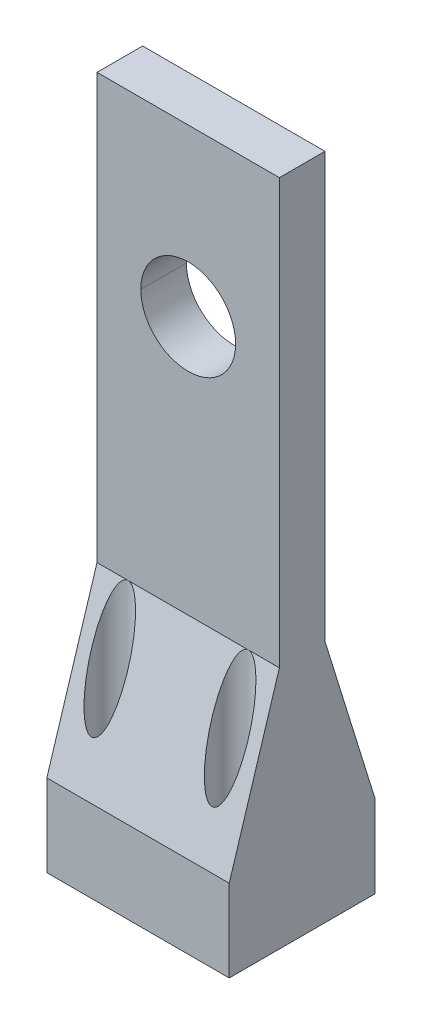
ISO-10303-21;
HEADER;
FILE_DESCRIPTION(('STEP AP214'),'2;1');
FILE_NAME('part.step','',(''),(''),'','','');
FILE_SCHEMA(('AUTOMOTIVE_DESIGN { 1 0 10303 214 1 1 1 1 }'));
ENDSEC;
DATA;
#1=APPLICATION_CONTEXT('core data for automotive mechanical design processes');
#2=APPLICATION_PROTOCOL_DEFINITION('international standard','automotive_design',2000,#1);
#3=PRODUCT_CONTEXT('',#1,'mechanical');
#4=PRODUCT('Part','Part','',(#3));
#5=PRODUCT_RELATED_PRODUCT_CATEGORY('part','',(#4));
#6=PRODUCT_DEFINITION_FORMATION('','',#4);
#7=PRODUCT_DEFINITION_CONTEXT('part definition',#1,'design');
#8=PRODUCT_DEFINITION('design','',#6,#7);
#9=PRODUCT_DEFINITION_SHAPE('','',#8);
#10=(LENGTH_UNIT() NAMED_UNIT(*) SI_UNIT(.MILLI.,.METRE.));
#11=(NAMED_UNIT(*) PLANE_ANGLE_UNIT() SI_UNIT($,.RADIAN.));
#12=(NAMED_UNIT(*) SI_UNIT($,.STERADIAN.) SOLID_ANGLE_UNIT());
#13=UNCERTAINTY_MEASURE_WITH_UNIT(LENGTH_MEASURE(1.E-05),#10,'distance_accuracy_value','');
#14=(GEOMETRIC_REPRESENTATION_CONTEXT(3) GLOBAL_UNCERTAINTY_ASSIGNED_CONTEXT((#13)) GLOBAL_UNIT_ASSIGNED_CONTEXT((#10,
#11,#12)) REPRESENTATION_CONTEXT('',''));
#15=CARTESIAN_POINT('',(0.,0.,0.));
#16=DIRECTION('',(0.,0.,1.));
#17=DIRECTION('',(1.,0.,0.));
#18=AXIS2_PLACEMENT_3D('',#15,#16,#17);
#19=CARTESIAN_POINT('',(6.8,5.,-4.));
#20=DIRECTION('',(0.,1.,0.));
#21=DIRECTION('',(0.,0.,-1.));
#22=AXIS2_PLACEMENT_3D('',#19,#20,#21);
#23=CYLINDRICAL_SURFACE('',#22,2.165);
#24=CARTESIAN_POINT('',(6.8,5.,-4.));
#25=DIRECTION('',(0.,-1.,0.));
#26=DIRECTION('',(1.,0.,0.));
#27=AXIS2_PLACEMENT_3D('',#24,#25,#26);
#28=CIRCLE('',#27,2.165);
#29=CARTESIAN_POINT('',(6.8,5.,-6.165));
#30=VERTEX_POINT('',#29);
#31=CARTESIAN_POINT('',(6.8,5.,-1.835));
#32=VERTEX_POINT('',#31);
#33=EDGE_CURVE('E343',#30,#32,#28,.T.);
#34=ORIENTED_EDGE('',*,*,#33,.F.);
#35=DIRECTION('',(0.,-1.,0.));
#36=VECTOR('',#35,1.);
#37=CARTESIAN_POINT('',(6.8,5.,-6.165));
#38=LINE('',#37,#36);
#39=CARTESIAN_POINT('',(6.8,-13.,-6.165));
#40=VERTEX_POINT('',#39);
#41=EDGE_CURVE('E347',#30,#40,#38,.T.);
#42=ORIENTED_EDGE('',*,*,#41,.T.);
#43=CARTESIAN_POINT('',(6.8,-13.,-4.));
#44=DIRECTION('',(0.,1.,0.));
#45=DIRECTION('',(0.,0.,1.));
#46=AXIS2_PLACEMENT_3D('',#43,#44,#45);
#47=CIRCLE('',#46,2.165);
#48=CARTESIAN_POINT('',(6.8,-13.,-1.835));
#49=VERTEX_POINT('',#48);
#50=EDGE_CURVE('E348',#49,#40,#47,.T.);
#51=ORIENTED_EDGE('',*,*,#50,.F.);
#52=DIRECTION('',(0.,1.,0.));
#53=VECTOR('',#52,1.);
#54=CARTESIAN_POINT('',(6.8,-13.,-1.835));
#55=LINE('',#54,#53);
#56=EDGE_CURVE('E352',#49,#32,#55,.T.);
#57=ORIENTED_EDGE('',*,*,#56,.T.);
#58=EDGE_LOOP('',(#34,#42,#51,#57));
#59=FACE_BOUND('',#58,.T.);
#60=ADVANCED_FACE('F39',(#59),#23,.F.);
#61=CARTESIAN_POINT('',(6.8,5.,-4.));
#62=DIRECTION('',(0.,1.,0.));
#63=DIRECTION('',(0.,0.,-1.));
#64=AXIS2_PLACEMENT_3D('',#61,#62,#63);
#65=CYLINDRICAL_SURFACE('',#64,2.165);
#66=CARTESIAN_POINT('',(6.8,5.,-4.));
#67=DIRECTION('',(0.,-1.,0.));
#68=DIRECTION('',(-1.,0.,0.));
#69=AXIS2_PLACEMENT_3D('',#66,#67,#68);
#70=CIRCLE('',#69,2.165);
#71=EDGE_CURVE('E356',#32,#30,#70,.T.);
#72=ORIENTED_EDGE('',*,*,#71,.F.);
#73=ORIENTED_EDGE('',*,*,#56,.F.);
#74=CARTESIAN_POINT('',(6.8,-13.,-4.));
#75=DIRECTION('',(0.,1.,0.));
#76=DIRECTION('',(0.,0.,-1.));
#77=AXIS2_PLACEMENT_3D('',#74,#75,#76);
#78=CIRCLE('',#77,2.165);
#79=EDGE_CURVE('E351',#40,#49,#78,.T.);
#80=ORIENTED_EDGE('',*,*,#79,.F.);
#81=ORIENTED_EDGE('',*,*,#41,.F.);
#82=EDGE_LOOP('',(#72,#73,#80,#81));
#83=FACE_BOUND('',#82,.T.);
#84=ADVANCED_FACE('F457',(#83),#65,.F.);
#85=CARTESIAN_POINT('',(33.2,5.,-4.));
#86=DIRECTION('',(0.,1.,0.));
#87=DIRECTION('',(0.,0.,-1.));
#88=AXIS2_PLACEMENT_3D('',#85,#86,#87);
#89=CYLINDRICAL_SURFACE('',#88,2.165);
#90=CARTESIAN_POINT('',(33.2,5.,-4.));
#91=DIRECTION('',(0.,-1.,0.));
#92=DIRECTION('',(-1.,0.,0.));
#93=AXIS2_PLACEMENT_3D('',#90,#91,#92);
#94=CIRCLE('',#93,2.165);
#95=CARTESIAN_POINT('',(33.2,5.,-1.835));
#96=VERTEX_POINT('',#95);
#97=CARTESIAN_POINT('',(33.2,5.,-6.165));
#98=VERTEX_POINT('',#97);
#99=EDGE_CURVE('E375',#96,#98,#94,.T.);
#100=ORIENTED_EDGE('',*,*,#99,.F.);
#101=DIRECTION('',(0.,1.,0.));
#102=VECTOR('',#101,1.);
#103=CARTESIAN_POINT('',(33.2,-13.,-1.835));
#104=LINE('',#103,#102);
#105=CARTESIAN_POINT('',(33.2,-13.,-1.835));
#106=VERTEX_POINT('',#105);
#107=EDGE_CURVE('E364',#106,#96,#104,.T.);
#108=ORIENTED_EDGE('',*,*,#107,.F.);
#109=CARTESIAN_POINT('',(33.2,-13.,-4.));
#110=DIRECTION('',(0.,1.,0.));
#111=DIRECTION('',(0.,0.,-1.));
#112=AXIS2_PLACEMENT_3D('',#109,#110,#111);
#113=CIRCLE('',#112,2.165);
#114=CARTESIAN_POINT('',(33.2,-13.,-6.165));
#115=VERTEX_POINT('',#114);
#116=EDGE_CURVE('E268',#115,#106,#113,.T.);
#117=ORIENTED_EDGE('',*,*,#116,.F.);
#118=DIRECTION('',(0.,-1.,0.));
#119=VECTOR('',#118,1.);
#120=CARTESIAN_POINT('',(33.2,5.,-6.165));
#121=LINE('',#120,#119);
#122=EDGE_CURVE('E263',#98,#115,#121,.T.);
#123=ORIENTED_EDGE('',*,*,#122,.F.);
#124=EDGE_LOOP('',(#100,#108,#117,#123));
#125=FACE_BOUND('',#124,.T.);
#126=ADVANCED_FACE('F444',(#125),#89,.F.);
#127=CARTESIAN_POINT('',(33.2,5.,-4.));
#128=DIRECTION('',(0.,1.,0.));
#129=DIRECTION('',(0.,0.,-1.));
#130=AXIS2_PLACEMENT_3D('',#127,#128,#129);
#131=CYLINDRICAL_SURFACE('',#130,2.165);
#132=CARTESIAN_POINT('',(33.2,5.,-4.));
#133=DIRECTION('',(0.,-1.,0.));
#134=DIRECTION('',(1.,0.,0.));
#135=AXIS2_PLACEMENT_3D('',#132,#133,#134);
#136=CIRCLE('',#135,2.165);
#137=EDGE_CURVE('E315',#98,#96,#136,.T.);
#138=ORIENTED_EDGE('',*,*,#137,.F.);
#139=ORIENTED_EDGE('',*,*,#122,.T.);
#140=CARTESIAN_POINT('',(33.2,-13.,-4.));
#141=DIRECTION('',(0.,1.,0.));
#142=DIRECTION('',(0.,0.,1.));
#143=AXIS2_PLACEMENT_3D('',#140,#141,#142);
#144=CIRCLE('',#143,2.165);
#145=EDGE_CURVE('E265',#106,#115,#144,.T.);
#146=ORIENTED_EDGE('',*,*,#145,.F.);
#147=ORIENTED_EDGE('',*,*,#107,.T.);
#148=EDGE_LOOP('',(#138,#139,#146,#147));
#149=FACE_BOUND('',#148,.T.);
#150=ADVANCED_FACE('F446',(#149),#131,.F.);
#151=CARTESIAN_POINT('',(6.8,5.,14.));
#152=DIRECTION('',(0.,1.,0.));
#153=DIRECTION('',(0.,0.,-1.));
#154=AXIS2_PLACEMENT_3D('',#151,#152,#153);
#155=CYLINDRICAL_SURFACE('',#154,2.165);
#156=CARTESIAN_POINT('',(6.8,5.,14.));
#157=DIRECTION('',(0.,-1.,0.));
#158=DIRECTION('',(1.,0.,0.));
#159=AXIS2_PLACEMENT_3D('',#156,#157,#158);
#160=CIRCLE('',#159,2.165);
#161=CARTESIAN_POINT('',(6.8,5.,11.835));
#162=VERTEX_POINT('',#161);
#163=CARTESIAN_POINT('',(6.8,5.,16.165));
#164=VERTEX_POINT('',#163);
#165=EDGE_CURVE('E235',#162,#164,#160,.T.);
#166=ORIENTED_EDGE('',*,*,#165,.F.);
#167=DIRECTION('',(0.,-1.,0.));
#168=VECTOR('',#167,1.);
#169=CARTESIAN_POINT('',(6.8,5.,11.835));
#170=LINE('',#169,#168);
#171=CARTESIAN_POINT('',(6.8,-13.,11.835));
#172=VERTEX_POINT('',#171);
#173=EDGE_CURVE('E242',#162,#172,#170,.T.);
#174=ORIENTED_EDGE('',*,*,#173,.T.);
#175=CARTESIAN_POINT('',(6.8,-13.,14.));
#176=DIRECTION('',(0.,1.,0.));
#177=DIRECTION('',(0.,0.,1.));
#178=AXIS2_PLACEMENT_3D('',#175,#176,#177);
#179=CIRCLE('',#178,2.165);
#180=CARTESIAN_POINT('',(6.8,-13.,16.165));
#181=VERTEX_POINT('',#180);
#182=EDGE_CURVE('E357',#181,#172,#179,.T.);
#183=ORIENTED_EDGE('',*,*,#182,.F.);
#184=DIRECTION('',(0.,1.,0.));
#185=VECTOR('',#184,1.);
#186=CARTESIAN_POINT('',(6.8,-13.,16.165));
#187=LINE('',#186,#185);
#188=EDGE_CURVE('E259',#181,#164,#187,.T.);
#189=ORIENTED_EDGE('',*,*,#188,.T.);
#190=EDGE_LOOP('',(#166,#174,#183,#189));
#191=FACE_BOUND('',#190,.T.);
#192=ADVANCED_FACE('F448',(#191),#155,.F.);
#193=CARTESIAN_POINT('',(6.8,5.,14.));
#194=DIRECTION('',(0.,1.,0.));
#195=DIRECTION('',(0.,0.,-1.));
#196=AXIS2_PLACEMENT_3D('',#193,#194,#195);
#197=CYLINDRICAL_SURFACE('',#196,2.165);
#198=CARTESIAN_POINT('',(6.8,5.,14.));
#199=DIRECTION('',(0.,-1.,0.));
#200=DIRECTION('',(-1.,0.,0.));
#201=AXIS2_PLACEMENT_3D('',#198,#199,#200);
#202=CIRCLE('',#201,2.165);
#203=EDGE_CURVE('E264',#164,#162,#202,.T.);
#204=ORIENTED_EDGE('',*,*,#203,.F.);
#205=ORIENTED_EDGE('',*,*,#188,.F.);
#206=CARTESIAN_POINT('',(6.8,-13.,14.));
#207=DIRECTION('',(0.,1.,0.));
#208=DIRECTION('',(0.,0.,-1.));
#209=AXIS2_PLACEMENT_3D('',#206,#207,#208);
#210=CIRCLE('',#209,2.165);
#211=EDGE_CURVE('E269',#172,#181,#210,.T.);
#212=ORIENTED_EDGE('',*,*,#211,.F.);
#213=ORIENTED_EDGE('',*,*,#173,.F.);
#214=EDGE_LOOP('',(#204,#205,#212,#213));
#215=FACE_BOUND('',#214,.T.);
#216=ADVANCED_FACE('F454',(#215),#197,.F.);
#217=CARTESIAN_POINT('',(33.2,5.,14.));
#218=DIRECTION('',(0.,1.,0.));
#219=DIRECTION('',(0.,0.,-1.));
#220=AXIS2_PLACEMENT_3D('',#217,#218,#219);
#221=CYLINDRICAL_SURFACE('',#220,2.165);
#222=CARTESIAN_POINT('',(33.2,5.,14.));
#223=DIRECTION('',(0.,-1.,0.));
#224=DIRECTION('',(1.,0.,0.));
#225=AXIS2_PLACEMENT_3D('',#222,#223,#224);
#226=CIRCLE('',#225,2.165);
#227=CARTESIAN_POINT('',(33.2,5.,11.835));
#228=VERTEX_POINT('',#227);
#229=CARTESIAN_POINT('',(33.2,5.,16.165));
#230=VERTEX_POINT('',#229);
#231=EDGE_CURVE('E226',#228,#230,#226,.T.);
#232=ORIENTED_EDGE('',*,*,#231,.F.);
#233=DIRECTION('',(0.,-1.,0.));
#234=VECTOR('',#233,1.);
#235=CARTESIAN_POINT('',(33.2,5.,11.835));
#236=LINE('',#235,#234);
#237=CARTESIAN_POINT('',(33.2,-13.,11.835));
#238=VERTEX_POINT('',#237);
#239=EDGE_CURVE('E222',#228,#238,#236,.T.);
#240=ORIENTED_EDGE('',*,*,#239,.T.);
#241=CARTESIAN_POINT('',(33.2,-13.,14.));
#242=DIRECTION('',(0.,1.,0.));
#243=DIRECTION('',(0.,0.,1.));
#244=AXIS2_PLACEMENT_3D('',#241,#242,#243);
#245=CIRCLE('',#244,2.165);
#246=CARTESIAN_POINT('',(33.2,-13.,16.165));
#247=VERTEX_POINT('',#246);
#248=EDGE_CURVE('E232',#247,#238,#245,.T.);
#249=ORIENTED_EDGE('',*,*,#248,.F.);
#250=DIRECTION('',(0.,1.,0.));
#251=VECTOR('',#250,1.);
#252=CARTESIAN_POINT('',(33.2,-13.,16.165));
#253=LINE('',#252,#251);
#254=EDGE_CURVE('E220',#247,#230,#253,.T.);
#255=ORIENTED_EDGE('',*,*,#254,.T.);
#256=EDGE_LOOP('',(#232,#240,#249,#255));
#257=FACE_BOUND('',#256,.T.);
#258=ADVANCED_FACE('F231',(#257),#221,.F.);
#259=CARTESIAN_POINT('',(33.2,5.,14.));
#260=DIRECTION('',(0.,1.,0.));
#261=DIRECTION('',(0.,0.,-1.));
#262=AXIS2_PLACEMENT_3D('',#259,#260,#261);
#263=CYLINDRICAL_SURFACE('',#262,2.165);
#264=CARTESIAN_POINT('',(33.2,5.,14.));
#265=DIRECTION('',(0.,-1.,0.));
#266=DIRECTION('',(-1.,0.,0.));
#267=AXIS2_PLACEMENT_3D('',#264,#265,#266);
#268=CIRCLE('',#267,2.165);
#269=EDGE_CURVE('E215',#230,#228,#268,.T.);
#270=ORIENTED_EDGE('',*,*,#269,.F.);
#271=ORIENTED_EDGE('',*,*,#254,.F.);
#272=CARTESIAN_POINT('',(33.2,-13.,14.));
#273=DIRECTION('',(0.,1.,0.));
#274=DIRECTION('',(0.,0.,-1.));
#275=AXIS2_PLACEMENT_3D('',#272,#273,#274);
#276=CIRCLE('',#275,2.165);
#277=EDGE_CURVE('E360',#238,#247,#276,.T.);
#278=ORIENTED_EDGE('',*,*,#277,.F.);
#279=ORIENTED_EDGE('',*,*,#239,.F.);
#280=EDGE_LOOP('',(#270,#271,#278,#279));
#281=FACE_BOUND('',#280,.T.);
#282=ADVANCED_FACE('F217',(#281),#263,.F.);
#283=CARTESIAN_POINT('',(0.,0.,0.));
#284=DIRECTION('',(0.,0.,1.));
#285=DIRECTION('',(1.,0.,0.));
#286=AXIS2_PLACEMENT_3D('',#283,#284,#285);
#287=PLANE('',#286);
#288=DIRECTION('',(0.,-1.,0.));
#289=VECTOR('',#288,1.);
#290=CARTESIAN_POINT('',(0.,133.5,0.));
#291=LINE('',#290,#289);
#292=CARTESIAN_POINT('',(0.,133.5,0.));
#293=VERTEX_POINT('',#292);
#294=CARTESIAN_POINT('',(0.,40.40735785167,0.));
#295=VERTEX_POINT('',#294);
#296=EDGE_CURVE('E250',#293,#295,#291,.T.);
#297=ORIENTED_EDGE('',*,*,#296,.F.);
#298=DIRECTION('',(-1.,0.,0.));
#299=VECTOR('',#298,1.);
#300=CARTESIAN_POINT('',(40.,133.5,0.));
#301=LINE('',#300,#299);
#302=CARTESIAN_POINT('',(40.,133.5,0.));
#303=VERTEX_POINT('',#302);
#304=EDGE_CURVE('E311',#303,#293,#301,.T.);
#305=ORIENTED_EDGE('',*,*,#304,.F.);
#306=DIRECTION('',(0.,1.,0.));
#307=VECTOR('',#306,1.);
#308=CARTESIAN_POINT('',(40.,40.40735785167,0.));
#309=LINE('',#308,#307);
#310=CARTESIAN_POINT('',(40.,40.40735785167,0.));
#311=VERTEX_POINT('',#310);
#312=EDGE_CURVE('E320',#311,#303,#309,.T.);
#313=ORIENTED_EDGE('',*,*,#312,.F.);
#314=DIRECTION('',(1.,0.,0.));
#315=VECTOR('',#314,1.);
#316=CARTESIAN_POINT('',(0.,40.40735785167,0.));
#317=LINE('',#316,#315);
#318=CARTESIAN_POINT('',(33.2,40.40735785167,0.));
#319=VERTEX_POINT('',#318);
#320=EDGE_CURVE('E300',#319,#311,#317,.T.);
#321=ORIENTED_EDGE('',*,*,#320,.F.);
#322=CARTESIAN_POINT('',(6.8,40.40735785167,0.));
#323=VERTEX_POINT('',#322);
#324=EDGE_CURVE('E290',#323,#319,#317,.T.);
#325=ORIENTED_EDGE('',*,*,#324,.F.);
#326=EDGE_CURVE('E293',#295,#323,#317,.T.);
#327=ORIENTED_EDGE('',*,*,#326,.F.);
#328=EDGE_LOOP('',(#297,#305,#313,#321,#325,#327));
#329=FACE_BOUND('',#328,.T.);
#330=CARTESIAN_POINT('',(20.,97.1,0.));
#331=DIRECTION('',(0.,0.,1.));
#332=DIRECTION('',(-1.,0.,0.));
#333=AXIS2_PLACEMENT_3D('',#330,#331,#332);
#334=CIRCLE('',#333,10.4);
#335=CARTESIAN_POINT('',(9.6,97.1,0.));
#336=VERTEX_POINT('',#335);
#337=CARTESIAN_POINT('',(30.4,97.1,0.));
#338=VERTEX_POINT('',#337);
#339=EDGE_CURVE('E11',#336,#338,#334,.T.);
#340=ORIENTED_EDGE('',*,*,#339,.T.);
#341=CARTESIAN_POINT('',(20.,97.1,0.));
#342=DIRECTION('',(0.,0.,1.));
#343=DIRECTION('',(1.,0.,0.));
#344=AXIS2_PLACEMENT_3D('',#341,#342,#343);
#345=CIRCLE('',#344,10.4);
#346=EDGE_CURVE('E49',#338,#336,#345,.T.);
#347=ORIENTED_EDGE('',*,*,#346,.T.);
#348=EDGE_LOOP('',(#340,#347));
#349=FACE_BOUND('',#348,.T.);
#350=ADVANCED_FACE('F297',(#329,#349),#287,.F.);
#351=CARTESIAN_POINT('',(20.,97.1,10.));
#352=DIRECTION('',(0.,0.,1.));
#353=DIRECTION('',(1.,0.,0.));
#354=AXIS2_PLACEMENT_3D('',#351,#352,#353);
#355=CYLINDRICAL_SURFACE('',#354,10.4);
#356=DIRECTION('',(0.,0.,-1.));
#357=VECTOR('',#356,1.);
#358=CARTESIAN_POINT('',(30.4,97.1,10.));
#359=LINE('',#358,#357);
#360=CARTESIAN_POINT('',(30.4,97.1,10.));
#361=VERTEX_POINT('',#360);
#362=EDGE_CURVE('E270',#361,#338,#359,.T.);
#363=ORIENTED_EDGE('',*,*,#362,.F.);
#364=CARTESIAN_POINT('',(20.,97.1,10.));
#365=DIRECTION('',(0.,0.,1.));
#366=DIRECTION('',(1.,0.,0.));
#367=AXIS2_PLACEMENT_3D('',#364,#365,#366);
#368=CIRCLE('',#367,10.4);
#369=CARTESIAN_POINT('',(9.6,97.1,10.));
#370=VERTEX_POINT('',#369);
#371=EDGE_CURVE('E406',#361,#370,#368,.T.);
#372=ORIENTED_EDGE('',*,*,#371,.T.);
#373=DIRECTION('',(0.,0.,-1.));
#374=VECTOR('',#373,1.);
#375=CARTESIAN_POINT('',(9.6,97.1,10.));
#376=LINE('',#375,#374);
#377=EDGE_CURVE('E368',#370,#336,#376,.T.);
#378=ORIENTED_EDGE('',*,*,#377,.T.);
#379=ORIENTED_EDGE('',*,*,#346,.F.);
#380=EDGE_LOOP('',(#363,#372,#378,#379));
#381=FACE_BOUND('',#380,.T.);
#382=ADVANCED_FACE('F477',(#381),#355,.F.);
#383=CARTESIAN_POINT('',(20.,97.1,10.));
#384=DIRECTION('',(0.,0.,1.));
#385=DIRECTION('',(1.,0.,0.));
#386=AXIS2_PLACEMENT_3D('',#383,#384,#385);
#387=CYLINDRICAL_SURFACE('',#386,10.4);
#388=ORIENTED_EDGE('',*,*,#377,.F.);
#389=CARTESIAN_POINT('',(20.,97.1,10.));
#390=DIRECTION('',(0.,0.,1.));
#391=DIRECTION('',(-1.,0.,0.));
#392=AXIS2_PLACEMENT_3D('',#389,#390,#391);
#393=CIRCLE('',#392,10.4);
#394=EDGE_CURVE('E274',#370,#361,#393,.T.);
#395=ORIENTED_EDGE('',*,*,#394,.T.);
#396=ORIENTED_EDGE('',*,*,#362,.T.);
#397=ORIENTED_EDGE('',*,*,#339,.F.);
#398=EDGE_LOOP('',(#388,#395,#396,#397));
#399=FACE_BOUND('',#398,.T.);
#400=ADVANCED_FACE('F475',(#399),#387,.F.);
#401=CARTESIAN_POINT('',(0.,0.,10.));
#402=DIRECTION('',(0.,0.,1.));
#403=DIRECTION('',(1.,0.,0.));
#404=AXIS2_PLACEMENT_3D('',#401,#402,#403);
#405=PLANE('',#404);
#406=DIRECTION('',(0.,1.,0.));
#407=VECTOR('',#406,1.);
#408=CARTESIAN_POINT('',(40.,40.40735785167,10.));
#409=LINE('',#408,#407);
#410=CARTESIAN_POINT('',(40.,40.40735785167,10.));
#411=VERTEX_POINT('',#410);
#412=CARTESIAN_POINT('',(40.,133.5,10.));
#413=VERTEX_POINT('',#412);
#414=EDGE_CURVE('E275',#411,#413,#409,.T.);
#415=ORIENTED_EDGE('',*,*,#414,.T.);
#416=DIRECTION('',(-1.,0.,0.));
#417=VECTOR('',#416,1.);
#418=CARTESIAN_POINT('',(40.,133.5,10.));
#419=LINE('',#418,#417);
#420=CARTESIAN_POINT('',(0.,133.5,10.));
#421=VERTEX_POINT('',#420);
#422=EDGE_CURVE('E393',#413,#421,#419,.T.);
#423=ORIENTED_EDGE('',*,*,#422,.T.);
#424=DIRECTION('',(0.,-1.,0.));
#425=VECTOR('',#424,1.);
#426=CARTESIAN_POINT('',(0.,133.5,10.));
#427=LINE('',#426,#425);
#428=CARTESIAN_POINT('',(0.,40.40735785167,10.));
#429=VERTEX_POINT('',#428);
#430=EDGE_CURVE('E246',#421,#429,#427,.T.);
#431=ORIENTED_EDGE('',*,*,#430,.T.);
#432=DIRECTION('',(1.,0.,0.));
#433=VECTOR('',#432,1.);
#434=CARTESIAN_POINT('',(0.,40.40735785167,10.));
#435=LINE('',#434,#433);
#436=CARTESIAN_POINT('',(6.8,40.4073578516696,10.));
#437=VERTEX_POINT('',#436);
#438=EDGE_CURVE('E416',#429,#437,#435,.T.);
#439=ORIENTED_EDGE('',*,*,#438,.T.);
#440=CARTESIAN_POINT('',(33.2,40.4073578516696,10.));
#441=VERTEX_POINT('',#440);
#442=EDGE_CURVE('E420',#437,#441,#435,.T.);
#443=ORIENTED_EDGE('',*,*,#442,.T.);
#444=EDGE_CURVE('E256',#441,#411,#435,.T.);
#445=ORIENTED_EDGE('',*,*,#444,.T.);
#446=EDGE_LOOP('',(#415,#423,#431,#439,#443,#445));
#447=FACE_BOUND('',#446,.T.);
#448=ORIENTED_EDGE('',*,*,#394,.F.);
#449=ORIENTED_EDGE('',*,*,#371,.F.);
#450=EDGE_LOOP('',(#448,#449));
#451=FACE_BOUND('',#450,.T.);
#452=ADVANCED_FACE('F471',(#447,#451),#405,.T.);
#453=CARTESIAN_POINT('',(0.,5.,21.));
#454=DIRECTION('',(0.,0.296682357708696,0.954976218878988));
#455=DIRECTION('',(1.,0.,0.));
#456=AXIS2_PLACEMENT_3D('',#453,#454,#455);
#457=PLANE('',#456);
#458=ORIENTED_EDGE('',*,*,#444,.F.);
#459=CARTESIAN_POINT('',(33.2,27.531954996517,14.));
#460=DIRECTION('',(0.,0.296682357708696,0.954976218878988));
#461=DIRECTION('',(0.,0.954976218878988,-0.296682357708696));
#462=AXIS2_PLACEMENT_3D('',#459,#460,#461);
#463=ELLIPSE('',#462,13.4824329659921,4.);
#464=EDGE_CURVE('E43',#441,#441,#463,.T.);
#465=ORIENTED_EDGE('',*,*,#464,.F.);
#466=ORIENTED_EDGE('',*,*,#442,.F.);
#467=CARTESIAN_POINT('',(6.8,27.531954996517,14.));
#468=DIRECTION('',(0.,0.296682357708696,0.954976218878988));
#469=DIRECTION('',(0.,0.954976218878988,-0.296682357708696));
#470=AXIS2_PLACEMENT_3D('',#467,#468,#469);
#471=ELLIPSE('',#470,13.4824329659921,4.);
#472=EDGE_CURVE('E59',#437,#437,#471,.T.);
#473=ORIENTED_EDGE('',*,*,#472,.F.);
#474=ORIENTED_EDGE('',*,*,#438,.F.);
#475=DIRECTION('',(0.,0.954976218878988,-0.296682357708696));
#476=VECTOR('',#475,1.);
#477=CARTESIAN_POINT('',(0.,5.,21.));
#478=LINE('',#477,#476);
#479=CARTESIAN_POINT('',(0.,5.,21.));
#480=VERTEX_POINT('',#479);
#481=EDGE_CURVE('E398',#480,#429,#478,.T.);
#482=ORIENTED_EDGE('',*,*,#481,.F.);
#483=DIRECTION('',(1.,0.,0.));
#484=VECTOR('',#483,1.);
#485=CARTESIAN_POINT('',(0.,5.,21.));
#486=LINE('',#485,#484);
#487=CARTESIAN_POINT('',(40.,5.,21.));
#488=VERTEX_POINT('',#487);
#489=EDGE_CURVE('E253',#480,#488,#486,.T.);
#490=ORIENTED_EDGE('',*,*,#489,.T.);
#491=DIRECTION('',(0.,0.954976218878988,-0.296682357708696));
#492=VECTOR('',#491,1.);
#493=CARTESIAN_POINT('',(40.,5.,21.));
#494=LINE('',#493,#492);
#495=EDGE_CURVE('E257',#488,#411,#494,.T.);
#496=ORIENTED_EDGE('',*,*,#495,.T.);
#497=EDGE_LOOP('',(#458,#465,#466,#473,#474,#482,#490,#496));
#498=FACE_BOUND('',#497,.T.);
#499=ADVANCED_FACE('F474',(#498),#457,.T.);
#500=CARTESIAN_POINT('',(40.,0.,0.));
#501=DIRECTION('',(1.,0.,0.));
#502=DIRECTION('',(0.,1.,0.));
#503=AXIS2_PLACEMENT_3D('',#500,#501,#502);
#504=PLANE('',#503);
#505=DIRECTION('',(0.,0.,1.));
#506=VECTOR('',#505,1.);
#507=CARTESIAN_POINT('',(40.,-13.,-11.));
#508=LINE('',#507,#506);
#509=CARTESIAN_POINT('',(40.,-13.,-11.));
#510=VERTEX_POINT('',#509);
#511=CARTESIAN_POINT('',(40.,-13.,21.));
#512=VERTEX_POINT('',#511);
#513=EDGE_CURVE('E338',#510,#512,#508,.T.);
#514=ORIENTED_EDGE('',*,*,#513,.F.);
#515=DIRECTION('',(0.,1.,0.));
#516=VECTOR('',#515,1.);
#517=CARTESIAN_POINT('',(40.,-13.,-11.));
#518=LINE('',#517,#516);
#519=CARTESIAN_POINT('',(40.,5.,-11.));
#520=VERTEX_POINT('',#519);
#521=EDGE_CURVE('E316',#510,#520,#518,.T.);
#522=ORIENTED_EDGE('',*,*,#521,.T.);
#523=DIRECTION('',(0.,-0.954976218878988,-0.296682357708696));
#524=VECTOR('',#523,1.);
#525=CARTESIAN_POINT('',(40.,40.40735785167,0.));
#526=LINE('',#525,#524);
#527=EDGE_CURVE('E307',#311,#520,#526,.T.);
#528=ORIENTED_EDGE('',*,*,#527,.F.);
#529=ORIENTED_EDGE('',*,*,#312,.T.);
#530=DIRECTION('',(0.,0.,1.));
#531=VECTOR('',#530,1.);
#532=CARTESIAN_POINT('',(40.,133.5,0.));
#533=LINE('',#532,#531);
#534=EDGE_CURVE('E324',#303,#413,#533,.T.);
#535=ORIENTED_EDGE('',*,*,#534,.T.);
#536=ORIENTED_EDGE('',*,*,#414,.F.);
#537=ORIENTED_EDGE('',*,*,#495,.F.);
#538=DIRECTION('',(0.,-1.,0.));
#539=VECTOR('',#538,1.);
#540=CARTESIAN_POINT('',(40.,5.,21.));
#541=LINE('',#540,#539);
#542=EDGE_CURVE('E328',#488,#512,#541,.T.);
#543=ORIENTED_EDGE('',*,*,#542,.T.);
#544=EDGE_LOOP('',(#514,#522,#528,#529,#535,#536,#537,#543));
#545=FACE_BOUND('',#544,.T.);
#546=ADVANCED_FACE('F488',(#545),#504,.T.);
#547=CARTESIAN_POINT('',(40.,0.,21.));
#548=DIRECTION('',(0.,0.,1.));
#549=DIRECTION('',(1.,0.,0.));
#550=AXIS2_PLACEMENT_3D('',#547,#548,#549);
#551=PLANE('',#550);
#552=DIRECTION('',(0.,-1.,0.));
#553=VECTOR('',#552,1.);
#554=CARTESIAN_POINT('',(0.,5.,21.));
#555=LINE('',#554,#553);
#556=CARTESIAN_POINT('',(0.,-13.,21.));
#557=VERTEX_POINT('',#556);
#558=EDGE_CURVE('E342',#480,#557,#555,.T.);
#559=ORIENTED_EDGE('',*,*,#558,.T.);
#560=DIRECTION('',(-1.,0.,0.));
#561=VECTOR('',#560,1.);
#562=CARTESIAN_POINT('',(40.,-13.,21.));
#563=LINE('',#562,#561);
#564=EDGE_CURVE('E333',#512,#557,#563,.T.);
#565=ORIENTED_EDGE('',*,*,#564,.F.);
#566=ORIENTED_EDGE('',*,*,#542,.F.);
#567=ORIENTED_EDGE('',*,*,#489,.F.);
#568=EDGE_LOOP('',(#559,#565,#566,#567));
#569=FACE_BOUND('',#568,.T.);
#570=ADVANCED_FACE('F491',(#569),#551,.T.);
#571=CARTESIAN_POINT('',(0.,-13.,0.));
#572=DIRECTION('',(0.,-1.,0.));
#573=DIRECTION('',(0.,0.,-1.));
#574=AXIS2_PLACEMENT_3D('',#571,#572,#573);
#575=PLANE('',#574);
#576=ORIENTED_EDGE('',*,*,#564,.T.);
#577=DIRECTION('',(0.,0.,-1.));
#578=VECTOR('',#577,1.);
#579=CARTESIAN_POINT('',(0.,-13.,21.));
#580=LINE('',#579,#578);
#581=CARTESIAN_POINT('',(0.,-13.,-11.));
#582=VERTEX_POINT('',#581);
#583=EDGE_CURVE('E329',#557,#582,#580,.T.);
#584=ORIENTED_EDGE('',*,*,#583,.T.);
#585=DIRECTION('',(1.,0.,0.));
#586=VECTOR('',#585,1.);
#587=CARTESIAN_POINT('',(0.,-13.,-11.));
#588=LINE('',#587,#586);
#589=EDGE_CURVE('E334',#582,#510,#588,.T.);
#590=ORIENTED_EDGE('',*,*,#589,.T.);
#591=ORIENTED_EDGE('',*,*,#513,.T.);
#592=EDGE_LOOP('',(#576,#584,#590,#591));
#593=FACE_BOUND('',#592,.T.);
#594=ORIENTED_EDGE('',*,*,#116,.T.);
#595=ORIENTED_EDGE('',*,*,#145,.T.);
#596=EDGE_LOOP('',(#594,#595));
#597=FACE_BOUND('',#596,.T.);
#598=ORIENTED_EDGE('',*,*,#211,.T.);
#599=ORIENTED_EDGE('',*,*,#182,.T.);
#600=EDGE_LOOP('',(#598,#599));
#601=FACE_BOUND('',#600,.T.);
#602=ORIENTED_EDGE('',*,*,#277,.T.);
#603=ORIENTED_EDGE('',*,*,#248,.T.);
#604=EDGE_LOOP('',(#602,#603));
#605=FACE_BOUND('',#604,.T.);
#606=ORIENTED_EDGE('',*,*,#79,.T.);
#607=ORIENTED_EDGE('',*,*,#50,.T.);
#608=EDGE_LOOP('',(#606,#607));
#609=FACE_BOUND('',#608,.T.);
#610=ADVANCED_FACE('F441',(#593,#597,#601,#605,#609),#575,.T.);
#611=CARTESIAN_POINT('',(0.,40.40735785167,0.));
#612=DIRECTION('',(0.,0.296682357708696,-0.954976218878988));
#613=DIRECTION('',(-1.,0.,0.));
#614=AXIS2_PLACEMENT_3D('',#611,#612,#613);
#615=PLANE('',#614);
#616=ORIENTED_EDGE('',*,*,#326,.T.);
#617=CARTESIAN_POINT('',(6.8,27.5319549965174,-4.));
#618=DIRECTION('',(0.,0.296682357708696,-0.954976218878988));
#619=DIRECTION('',(0.,0.954976218878988,0.296682357708696));
#620=AXIS2_PLACEMENT_3D('',#617,#618,#619);
#621=ELLIPSE('',#620,13.4824329659921,4.);
#622=EDGE_CURVE('E278',#323,#323,#621,.T.);
#623=ORIENTED_EDGE('',*,*,#622,.F.);
#624=ORIENTED_EDGE('',*,*,#324,.T.);
#625=CARTESIAN_POINT('',(33.2,27.5319549965174,-4.));
#626=DIRECTION('',(0.,0.296682357708696,-0.954976218878988));
#627=DIRECTION('',(0.,0.954976218878988,0.296682357708696));
#628=AXIS2_PLACEMENT_3D('',#625,#626,#627);
#629=ELLIPSE('',#628,13.4824329659921,4.);
#630=EDGE_CURVE('E276',#319,#319,#629,.T.);
#631=ORIENTED_EDGE('',*,*,#630,.F.);
#632=ORIENTED_EDGE('',*,*,#320,.T.);
#633=ORIENTED_EDGE('',*,*,#527,.T.);
#634=DIRECTION('',(1.,0.,0.));
#635=VECTOR('',#634,1.);
#636=CARTESIAN_POINT('',(0.,5.,-11.));
#637=LINE('',#636,#635);
#638=CARTESIAN_POINT('',(0.,5.,-11.));
#639=VERTEX_POINT('',#638);
#640=EDGE_CURVE('E402',#639,#520,#637,.T.);
#641=ORIENTED_EDGE('',*,*,#640,.F.);
#642=DIRECTION('',(0.,-0.954976218878988,-0.296682357708696));
#643=VECTOR('',#642,1.);
#644=CARTESIAN_POINT('',(0.,40.40735785167,0.));
#645=LINE('',#644,#643);
#646=EDGE_CURVE('E248',#295,#639,#645,.T.);
#647=ORIENTED_EDGE('',*,*,#646,.F.);
#648=EDGE_LOOP('',(#616,#623,#624,#631,#632,#633,#641,#647));
#649=FACE_BOUND('',#648,.T.);
#650=ADVANCED_FACE('F288',(#649),#615,.T.);
#651=CARTESIAN_POINT('',(0.,133.5,0.));
#652=DIRECTION('',(-1.,0.,0.));
#653=DIRECTION('',(0.,0.,1.));
#654=AXIS2_PLACEMENT_3D('',#651,#652,#653);
#655=PLANE('',#654);
#656=DIRECTION('',(0.,0.,1.));
#657=VECTOR('',#656,1.);
#658=CARTESIAN_POINT('',(0.,133.5,0.));
#659=LINE('',#658,#657);
#660=EDGE_CURVE('E314',#293,#421,#659,.T.);
#661=ORIENTED_EDGE('',*,*,#660,.F.);
#662=ORIENTED_EDGE('',*,*,#296,.T.);
#663=ORIENTED_EDGE('',*,*,#646,.T.);
#664=DIRECTION('',(0.,-1.,0.));
#665=VECTOR('',#664,1.);
#666=CARTESIAN_POINT('',(0.,5.,-11.));
#667=LINE('',#666,#665);
#668=EDGE_CURVE('E251',#639,#582,#667,.T.);
#669=ORIENTED_EDGE('',*,*,#668,.T.);
#670=ORIENTED_EDGE('',*,*,#583,.F.);
#671=ORIENTED_EDGE('',*,*,#558,.F.);
#672=ORIENTED_EDGE('',*,*,#481,.T.);
#673=ORIENTED_EDGE('',*,*,#430,.F.);
#674=EDGE_LOOP('',(#661,#662,#663,#669,#670,#671,#672,#673));
#675=FACE_BOUND('',#674,.T.);
#676=ADVANCED_FACE('F493',(#675),#655,.T.);
#677=CARTESIAN_POINT('',(0.,0.,-11.));
#678=DIRECTION('',(0.,0.,-1.));
#679=DIRECTION('',(0.,-1.,0.));
#680=AXIS2_PLACEMENT_3D('',#677,#678,#679);
#681=PLANE('',#680);
#682=ORIENTED_EDGE('',*,*,#521,.F.);
#683=ORIENTED_EDGE('',*,*,#589,.F.);
#684=ORIENTED_EDGE('',*,*,#668,.F.);
#685=ORIENTED_EDGE('',*,*,#640,.T.);
#686=EDGE_LOOP('',(#682,#683,#684,#685));
#687=FACE_BOUND('',#686,.T.);
#688=ADVANCED_FACE('F41',(#687),#681,.T.);
#689=CARTESIAN_POINT('',(40.,133.5,0.));
#690=DIRECTION('',(0.,1.,0.));
#691=DIRECTION('',(1.,0.,0.));
#692=AXIS2_PLACEMENT_3D('',#689,#690,#691);
#693=PLANE('',#692);
#694=ORIENTED_EDGE('',*,*,#660,.T.);
#695=ORIENTED_EDGE('',*,*,#422,.F.);
#696=ORIENTED_EDGE('',*,*,#534,.F.);
#697=ORIENTED_EDGE('',*,*,#304,.T.);
#698=EDGE_LOOP('',(#694,#695,#696,#697));
#699=FACE_BOUND('',#698,.T.);
#700=ADVANCED_FACE('F528',(#699),#693,.T.);
#701=CARTESIAN_POINT('',(33.2,5.,14.));
#702=DIRECTION('',(0.,1.,0.));
#703=DIRECTION('',(0.,0.,1.));
#704=AXIS2_PLACEMENT_3D('',#701,#702,#703);
#705=PLANE('',#704);
#706=CARTESIAN_POINT('',(33.2,5.,14.));
#707=DIRECTION('',(0.,1.,0.));
#708=DIRECTION('',(0.,0.,1.));
#709=AXIS2_PLACEMENT_3D('',#706,#707,#708);
#710=CIRCLE('',#709,4.);
#711=CARTESIAN_POINT('',(33.2,5.,18.));
#712=VERTEX_POINT('',#711);
#713=EDGE_CURVE('E865',#712,#712,#710,.T.);
#714=ORIENTED_EDGE('',*,*,#713,.T.);
#715=EDGE_LOOP('',(#714));
#716=FACE_BOUND('',#715,.T.);
#717=ORIENTED_EDGE('',*,*,#269,.T.);
#718=ORIENTED_EDGE('',*,*,#231,.T.);
#719=EDGE_LOOP('',(#717,#718));
#720=FACE_BOUND('',#719,.T.);
#721=ADVANCED_FACE('F227',(#716,#720),#705,.T.);
#722=CARTESIAN_POINT('',(33.2,5.,14.));
#723=DIRECTION('',(0.,1.,0.));
#724=DIRECTION('',(0.,0.,1.));
#725=AXIS2_PLACEMENT_3D('',#722,#723,#724);
#726=CYLINDRICAL_SURFACE('',#725,4.);
#727=ORIENTED_EDGE('',*,*,#464,.T.);
#728=EDGE_LOOP('',(#727));
#729=FACE_BOUND('',#728,.T.);
#730=ORIENTED_EDGE('',*,*,#713,.F.);
#731=EDGE_LOOP('',(#730));
#732=FACE_BOUND('',#731,.T.);
#733=ADVANCED_FACE('F596',(#729,#732),#726,.F.);
#734=CARTESIAN_POINT('',(6.8,5.,14.));
#735=DIRECTION('',(0.,1.,0.));
#736=DIRECTION('',(0.,0.,1.));
#737=AXIS2_PLACEMENT_3D('',#734,#735,#736);
#738=PLANE('',#737);
#739=CARTESIAN_POINT('',(6.8,5.,14.));
#740=DIRECTION('',(0.,1.,0.));
#741=DIRECTION('',(0.,0.,1.));
#742=AXIS2_PLACEMENT_3D('',#739,#740,#741);
#743=CIRCLE('',#742,4.);
#744=CARTESIAN_POINT('',(6.8,5.,18.));
#745=VERTEX_POINT('',#744);
#746=EDGE_CURVE('E279',#745,#745,#743,.T.);
#747=ORIENTED_EDGE('',*,*,#746,.T.);
#748=EDGE_LOOP('',(#747));
#749=FACE_BOUND('',#748,.T.);
#750=ORIENTED_EDGE('',*,*,#203,.T.);
#751=ORIENTED_EDGE('',*,*,#165,.T.);
#752=EDGE_LOOP('',(#750,#751));
#753=FACE_BOUND('',#752,.T.);
#754=ADVANCED_FACE('F592',(#749,#753),#738,.T.);
#755=CARTESIAN_POINT('',(6.8,5.,14.));
#756=DIRECTION('',(0.,1.,0.));
#757=DIRECTION('',(0.,0.,1.));
#758=AXIS2_PLACEMENT_3D('',#755,#756,#757);
#759=CYLINDRICAL_SURFACE('',#758,4.);
#760=ORIENTED_EDGE('',*,*,#472,.T.);
#761=EDGE_LOOP('',(#760));
#762=FACE_BOUND('',#761,.T.);
#763=ORIENTED_EDGE('',*,*,#746,.F.);
#764=EDGE_LOOP('',(#763));
#765=FACE_BOUND('',#764,.T.);
#766=ADVANCED_FACE('F595',(#762,#765),#759,.F.);
#767=CARTESIAN_POINT('',(33.2,5.,-4.));
#768=DIRECTION('',(0.,1.,0.));
#769=DIRECTION('',(0.,0.,1.));
#770=AXIS2_PLACEMENT_3D('',#767,#768,#769);
#771=PLANE('',#770);
#772=CARTESIAN_POINT('',(33.2,5.,-4.));
#773=DIRECTION('',(0.,1.,0.));
#774=DIRECTION('',(0.,0.,1.));
#775=AXIS2_PLACEMENT_3D('',#772,#773,#774);
#776=CIRCLE('',#775,4.);
#777=CARTESIAN_POINT('',(33.2,5.,0.));
#778=VERTEX_POINT('',#777);
#779=EDGE_CURVE('E863',#778,#778,#776,.T.);
#780=ORIENTED_EDGE('',*,*,#779,.T.);
#781=EDGE_LOOP('',(#780));
#782=FACE_BOUND('',#781,.T.);
#783=ORIENTED_EDGE('',*,*,#137,.T.);
#784=ORIENTED_EDGE('',*,*,#99,.T.);
#785=EDGE_LOOP('',(#783,#784));
#786=FACE_BOUND('',#785,.T.);
#787=ADVANCED_FACE('F445',(#782,#786),#771,.T.);
#788=CARTESIAN_POINT('',(33.2,5.,-4.));
#789=DIRECTION('',(0.,1.,0.));
#790=DIRECTION('',(0.,0.,1.));
#791=AXIS2_PLACEMENT_3D('',#788,#789,#790);
#792=CYLINDRICAL_SURFACE('',#791,4.);
#793=ORIENTED_EDGE('',*,*,#630,.T.);
#794=EDGE_LOOP('',(#793));
#795=FACE_BOUND('',#794,.T.);
#796=ORIENTED_EDGE('',*,*,#779,.F.);
#797=EDGE_LOOP('',(#796));
#798=FACE_BOUND('',#797,.T.);
#799=ADVANCED_FACE('F579',(#795,#798),#792,.F.);
#800=CARTESIAN_POINT('',(6.8,5.,-4.));
#801=DIRECTION('',(0.,1.,0.));
#802=DIRECTION('',(0.,0.,1.));
#803=AXIS2_PLACEMENT_3D('',#800,#801,#802);
#804=PLANE('',#803);
#805=CARTESIAN_POINT('',(6.8,5.,-4.));
#806=DIRECTION('',(0.,1.,0.));
#807=DIRECTION('',(0.,0.,1.));
#808=AXIS2_PLACEMENT_3D('',#805,#806,#807);
#809=CIRCLE('',#808,4.);
#810=CARTESIAN_POINT('',(6.8,5.,0.));
#811=VERTEX_POINT('',#810);
#812=EDGE_CURVE('E866',#811,#811,#809,.T.);
#813=ORIENTED_EDGE('',*,*,#812,.T.);
#814=EDGE_LOOP('',(#813));
#815=FACE_BOUND('',#814,.T.);
#816=ORIENTED_EDGE('',*,*,#71,.T.);
#817=ORIENTED_EDGE('',*,*,#33,.T.);
#818=EDGE_LOOP('',(#816,#817));
#819=FACE_BOUND('',#818,.T.);
#820=ADVANCED_FACE('F577',(#815,#819),#804,.T.);
#821=CARTESIAN_POINT('',(6.8,5.,-4.));
#822=DIRECTION('',(0.,1.,0.));
#823=DIRECTION('',(0.,0.,1.));
#824=AXIS2_PLACEMENT_3D('',#821,#822,#823);
#825=CYLINDRICAL_SURFACE('',#824,4.);
#826=ORIENTED_EDGE('',*,*,#622,.T.);
#827=EDGE_LOOP('',(#826));
#828=FACE_BOUND('',#827,.T.);
#829=ORIENTED_EDGE('',*,*,#812,.F.);
#830=EDGE_LOOP('',(#829));
#831=FACE_BOUND('',#830,.T.);
#832=ADVANCED_FACE('F282',(#828,#831),#825,.F.);
#833=CLOSED_SHELL('',(#60,#84,#126,#150,#192,#216,#258,#282,#350,#382,#400,#452,#499,#546,#570,
#610,#650,#676,#688,#700,#721,#733,#754,#766,#787,#799,#820,#832));
#834=MANIFOLD_SOLID_BREP('B2',#833);
#835=ADVANCED_BREP_SHAPE_REPRESENTATION('',(#18,#834),#14);
#836=SHAPE_DEFINITION_REPRESENTATION(#9,#835);
ENDSEC;
END-ISO-10303-21;
